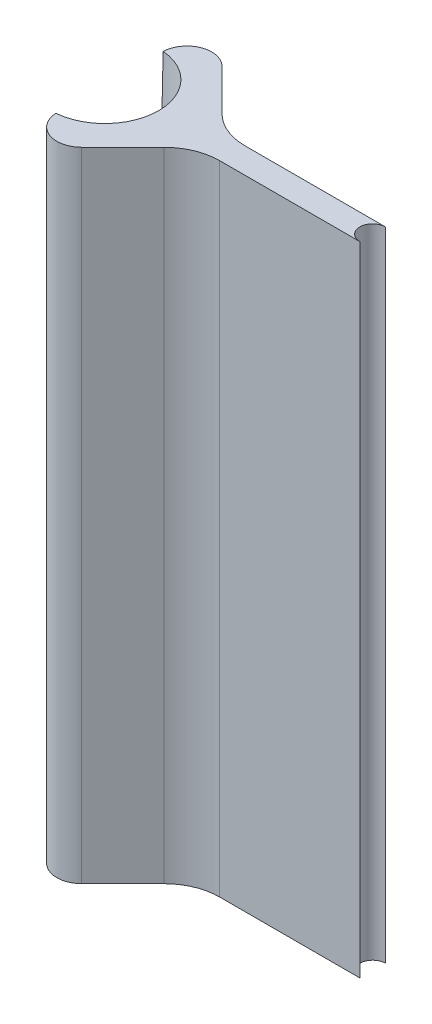
ISO-10303-21;
HEADER;
FILE_DESCRIPTION(('STEP AP214'),'2;1');
FILE_NAME('part.step','',(''),(''),'','','');
FILE_SCHEMA(('AUTOMOTIVE_DESIGN { 1 0 10303 214 1 1 1 1 }'));
ENDSEC;
DATA;
#1=APPLICATION_CONTEXT('core data for automotive mechanical design processes');
#2=APPLICATION_PROTOCOL_DEFINITION('international standard','automotive_design',2000,#1);
#3=PRODUCT_CONTEXT('',#1,'mechanical');
#4=PRODUCT('Part','Part','',(#3));
#5=PRODUCT_RELATED_PRODUCT_CATEGORY('part','',(#4));
#6=PRODUCT_DEFINITION_FORMATION('','',#4);
#7=PRODUCT_DEFINITION_CONTEXT('part definition',#1,'design');
#8=PRODUCT_DEFINITION('design','',#6,#7);
#9=PRODUCT_DEFINITION_SHAPE('','',#8);
#10=(LENGTH_UNIT() NAMED_UNIT(*) SI_UNIT(.MILLI.,.METRE.));
#11=(NAMED_UNIT(*) PLANE_ANGLE_UNIT() SI_UNIT($,.RADIAN.));
#12=(NAMED_UNIT(*) SI_UNIT($,.STERADIAN.) SOLID_ANGLE_UNIT());
#13=UNCERTAINTY_MEASURE_WITH_UNIT(LENGTH_MEASURE(1.E-05),#10,'distance_accuracy_value','');
#14=(GEOMETRIC_REPRESENTATION_CONTEXT(3) GLOBAL_UNCERTAINTY_ASSIGNED_CONTEXT((#13)) GLOBAL_UNIT_ASSIGNED_CONTEXT((#10,
#11,#12)) REPRESENTATION_CONTEXT('',''));
#15=CARTESIAN_POINT('',(0.,0.,0.));
#16=DIRECTION('',(0.,0.,1.));
#17=DIRECTION('',(1.,0.,0.));
#18=AXIS2_PLACEMENT_3D('',#15,#16,#17);
#19=CARTESIAN_POINT('',(4.2,10.,0.));
#20=DIRECTION('',(0.,-1.,0.));
#21=DIRECTION('',(0.,0.,-1.));
#22=AXIS2_PLACEMENT_3D('',#19,#20,#21);
#23=CYLINDRICAL_SURFACE('',#22,0.2);
#24=CARTESIAN_POINT('',(4.2,0.,0.));
#25=DIRECTION('',(0.,1.,0.));
#26=DIRECTION('',(0.,0.,1.));
#27=AXIS2_PLACEMENT_3D('',#24,#25,#26);
#28=CIRCLE('',#27,0.2);
#29=CARTESIAN_POINT('',(4.2,0.,-0.2));
#30=VERTEX_POINT('',#29);
#31=CARTESIAN_POINT('',(4.2,0.,0.2));
#32=VERTEX_POINT('',#31);
#33=EDGE_CURVE('E185',#30,#32,#28,.T.);
#34=ORIENTED_EDGE('',*,*,#33,.F.);
#35=DIRECTION('',(0.,-1.,0.));
#36=VECTOR('',#35,1.);
#37=CARTESIAN_POINT('',(4.2,10.,-0.2));
#38=LINE('',#37,#36);
#39=CARTESIAN_POINT('',(4.2,10.,-0.2));
#40=VERTEX_POINT('',#39);
#41=EDGE_CURVE('E11',#40,#30,#38,.T.);
#42=ORIENTED_EDGE('',*,*,#41,.F.);
#43=CARTESIAN_POINT('',(4.2,10.,0.));
#44=DIRECTION('',(0.,1.,0.));
#45=DIRECTION('',(0.,0.,1.));
#46=AXIS2_PLACEMENT_3D('',#43,#44,#45);
#47=CIRCLE('',#46,0.2);
#48=CARTESIAN_POINT('',(4.2,10.,0.2));
#49=VERTEX_POINT('',#48);
#50=EDGE_CURVE('E223',#40,#49,#47,.T.);
#51=ORIENTED_EDGE('',*,*,#50,.T.);
#52=DIRECTION('',(0.,-1.,0.));
#53=VECTOR('',#52,1.);
#54=CARTESIAN_POINT('',(4.2,10.,0.2));
#55=LINE('',#54,#53);
#56=EDGE_CURVE('E123',#49,#32,#55,.T.);
#57=ORIENTED_EDGE('',*,*,#56,.T.);
#58=EDGE_LOOP('',(#34,#42,#51,#57));
#59=FACE_BOUND('',#58,.T.);
#60=ADVANCED_FACE('F46',(#59),#23,.F.);
#61=CARTESIAN_POINT('',(0.,10.,-0.2));
#62=DIRECTION('',(0.,0.,-1.));
#63=DIRECTION('',(-1.,0.,0.));
#64=AXIS2_PLACEMENT_3D('',#61,#62,#63);
#65=PLANE('',#64);
#66=DIRECTION('',(1.,0.,0.));
#67=VECTOR('',#66,1.);
#68=CARTESIAN_POINT('',(0.,0.,-0.2));
#69=LINE('',#68,#67);
#70=CARTESIAN_POINT('',(2.,0.,-0.2));
#71=VERTEX_POINT('',#70);
#72=EDGE_CURVE('E189',#71,#30,#69,.T.);
#73=ORIENTED_EDGE('',*,*,#72,.F.);
#74=DIRECTION('',(0.,-1.,0.));
#75=VECTOR('',#74,1.);
#76=CARTESIAN_POINT('',(2.,10.,-0.2));
#77=LINE('',#76,#75);
#78=CARTESIAN_POINT('',(2.,10.,-0.2));
#79=VERTEX_POINT('',#78);
#80=EDGE_CURVE('E55',#79,#71,#77,.T.);
#81=ORIENTED_EDGE('',*,*,#80,.F.);
#82=DIRECTION('',(1.,0.,0.));
#83=VECTOR('',#82,1.);
#84=CARTESIAN_POINT('',(0.,10.,-0.2));
#85=LINE('',#84,#83);
#86=EDGE_CURVE('E267',#79,#40,#85,.T.);
#87=ORIENTED_EDGE('',*,*,#86,.T.);
#88=ORIENTED_EDGE('',*,*,#41,.T.);
#89=EDGE_LOOP('',(#73,#81,#87,#88));
#90=FACE_BOUND('',#89,.T.);
#91=ADVANCED_FACE('F254',(#90),#65,.T.);
#92=CARTESIAN_POINT('',(2.,10.,-1.07279220613579));
#93=DIRECTION('',(0.,-1.,0.));
#94=DIRECTION('',(0.,0.,-1.));
#95=AXIS2_PLACEMENT_3D('',#92,#93,#94);
#96=CYLINDRICAL_SURFACE('',#95,0.872792206135791);
#97=CARTESIAN_POINT('',(2.,0.,-1.07279220613579));
#98=DIRECTION('',(0.,1.,0.));
#99=DIRECTION('',(0.,0.,1.));
#100=AXIS2_PLACEMENT_3D('',#97,#98,#99);
#101=CIRCLE('',#100,0.872792206135791);
#102=CARTESIAN_POINT('',(1.38284271247461,0.,-0.455634918610408));
#103=VERTEX_POINT('',#102);
#104=EDGE_CURVE('E194',#103,#71,#101,.T.);
#105=ORIENTED_EDGE('',*,*,#104,.F.);
#106=DIRECTION('',(0.,-1.,0.));
#107=VECTOR('',#106,1.);
#108=CARTESIAN_POINT('',(1.38284271247461,10.,-0.455634918610408));
#109=LINE('',#108,#107);
#110=CARTESIAN_POINT('',(1.38284271247461,10.,-0.455634918610408));
#111=VERTEX_POINT('',#110);
#112=EDGE_CURVE('E240',#111,#103,#109,.T.);
#113=ORIENTED_EDGE('',*,*,#112,.F.);
#114=CARTESIAN_POINT('',(2.,10.,-1.07279220613579));
#115=DIRECTION('',(0.,1.,0.));
#116=DIRECTION('',(0.,0.,1.));
#117=AXIS2_PLACEMENT_3D('',#114,#115,#116);
#118=CIRCLE('',#117,0.872792206135791);
#119=EDGE_CURVE('E250',#111,#79,#118,.T.);
#120=ORIENTED_EDGE('',*,*,#119,.T.);
#121=ORIENTED_EDGE('',*,*,#80,.T.);
#122=EDGE_LOOP('',(#105,#113,#120,#121));
#123=FACE_BOUND('',#122,.T.);
#124=ADVANCED_FACE('F248',(#123),#96,.F.);
#125=CARTESIAN_POINT('',(0.919238815542513,10.,-0.919238815542511));
#126=DIRECTION('',(0.707106781186548,0.,-0.707106781186547));
#127=DIRECTION('',(-0.707106781186547,0.,-0.707106781186548));
#128=AXIS2_PLACEMENT_3D('',#125,#126,#127);
#129=PLANE('',#128);
#130=DIRECTION('',(0.707106781186547,0.,0.707106781186548));
#131=VECTOR('',#130,1.);
#132=CARTESIAN_POINT('',(0.919238815542513,0.,-0.919238815542511));
#133=LINE('',#132,#131);
#134=CARTESIAN_POINT('',(0.738477631085024,0.,-1.1));
#135=VERTEX_POINT('',#134);
#136=EDGE_CURVE('E198',#135,#103,#133,.T.);
#137=ORIENTED_EDGE('',*,*,#136,.F.);
#138=DIRECTION('',(0.,-1.,0.));
#139=VECTOR('',#138,1.);
#140=CARTESIAN_POINT('',(0.738477631085024,10.,-1.1));
#141=LINE('',#140,#139);
#142=CARTESIAN_POINT('',(0.738477631085024,10.,-1.1));
#143=VERTEX_POINT('',#142);
#144=EDGE_CURVE('E237',#143,#135,#141,.T.);
#145=ORIENTED_EDGE('',*,*,#144,.F.);
#146=DIRECTION('',(0.707106781186547,0.,0.707106781186548));
#147=VECTOR('',#146,1.);
#148=CARTESIAN_POINT('',(0.919238815542513,10.,-0.919238815542511));
#149=LINE('',#148,#147);
#150=EDGE_CURVE('E264',#143,#111,#149,.T.);
#151=ORIENTED_EDGE('',*,*,#150,.T.);
#152=ORIENTED_EDGE('',*,*,#112,.T.);
#153=EDGE_LOOP('',(#137,#145,#151,#152));
#154=FACE_BOUND('',#153,.T.);
#155=ADVANCED_FACE('F261',(#154),#129,.T.);
#156=CARTESIAN_POINT('',(0.463089493616225,10.,-0.824611862531202));
#157=DIRECTION('',(0.,-1.,0.));
#158=DIRECTION('',(0.,0.,-1.));
#159=AXIS2_PLACEMENT_3D('',#156,#157,#158);
#160=CYLINDRICAL_SURFACE('',#159,0.389457638925041);
#161=CARTESIAN_POINT('',(0.463089493616225,0.,-0.824611862531202));
#162=DIRECTION('',(0.,1.,0.));
#163=DIRECTION('',(0.,0.,1.));
#164=AXIS2_PLACEMENT_3D('',#161,#162,#163);
#165=CIRCLE('',#164,0.389457638925041);
#166=CARTESIAN_POINT('',(0.0751138585877696,0.,-0.858555332320462));
#167=VERTEX_POINT('',#166);
#168=EDGE_CURVE('E202',#167,#135,#165,.F.);
#169=ORIENTED_EDGE('',*,*,#168,.F.);
#170=DIRECTION('',(0.,-1.,0.));
#171=VECTOR('',#170,1.);
#172=CARTESIAN_POINT('',(0.0751138585877696,10.,-0.858555332320462));
#173=LINE('',#172,#171);
#174=CARTESIAN_POINT('',(0.0751138585877696,10.,-0.858555332320462));
#175=VERTEX_POINT('',#174);
#176=EDGE_CURVE('E234',#175,#167,#173,.T.);
#177=ORIENTED_EDGE('',*,*,#176,.F.);
#178=CARTESIAN_POINT('',(0.463089493616225,10.,-0.824611862531202));
#179=DIRECTION('',(0.,1.,0.));
#180=DIRECTION('',(0.,0.,1.));
#181=AXIS2_PLACEMENT_3D('',#178,#179,#180);
#182=CIRCLE('',#181,0.389457638925041);
#183=EDGE_CURVE('E272',#175,#143,#182,.F.);
#184=ORIENTED_EDGE('',*,*,#183,.T.);
#185=ORIENTED_EDGE('',*,*,#144,.T.);
#186=EDGE_LOOP('',(#169,#177,#184,#185));
#187=FACE_BOUND('',#186,.T.);
#188=ADVANCED_FACE('F323',(#187),#160,.T.);
#189=CARTESIAN_POINT('',(0.,10.,0.));
#190=DIRECTION('',(-0.996194698091746,0.,-0.0871557427476545));
#191=DIRECTION('',(-0.0871557427476545,0.,0.996194698091746));
#192=AXIS2_PLACEMENT_3D('',#189,#190,#191);
#193=PLANE('',#192);
#194=DIRECTION('',(-0.00182525215986723,-0.999780683474846,0.0208627276530114));
#195=VECTOR('',#194,1.);
#196=CARTESIAN_POINT('',(0.,-30.3145833930611,0.));
#197=LINE('',#196,#195);
#198=CARTESIAN_POINT('',(0.0553438966447606,0.,-0.632583633288259));
#199=VERTEX_POINT('',#198);
#200=CARTESIAN_POINT('',(0.0736004222011793,10.,-0.841256675264832));
#201=VERTEX_POINT('',#200);
#202=EDGE_CURVE('E305',#199,#201,#197,.F.);
#203=ORIENTED_EDGE('',*,*,#202,.T.);
#204=DIRECTION('',(0.0871557427476545,0.,-0.996194698091746));
#205=VECTOR('',#204,1.);
#206=CARTESIAN_POINT('',(0.,10.,0.));
#207=LINE('',#206,#205);
#208=EDGE_CURVE('E280',#201,#175,#207,.T.);
#209=ORIENTED_EDGE('',*,*,#208,.T.);
#210=ORIENTED_EDGE('',*,*,#176,.T.);
#211=DIRECTION('',(0.0871557427476545,0.,-0.996194698091746));
#212=VECTOR('',#211,1.);
#213=CARTESIAN_POINT('',(0.,0.,0.));
#214=LINE('',#213,#212);
#215=EDGE_CURVE('E206',#199,#167,#214,.T.);
#216=ORIENTED_EDGE('',*,*,#215,.F.);
#217=EDGE_LOOP('',(#203,#209,#210,#216));
#218=FACE_BOUND('',#217,.T.);
#219=ADVANCED_FACE('F320',(#218),#193,.T.);
#220=CARTESIAN_POINT('',(0.,10.,0.));
#221=DIRECTION('',(0.996194698091746,0.,-0.0871557427476545));
#222=DIRECTION('',(-0.0871557427476545,0.,-0.996194698091746));
#223=AXIS2_PLACEMENT_3D('',#220,#221,#222);
#224=PLANE('',#223);
#225=DIRECTION('',(0.0871557427476545,0.,0.996194698091746));
#226=VECTOR('',#225,1.);
#227=CARTESIAN_POINT('',(0.,10.,0.));
#228=LINE('',#227,#226);
#229=CARTESIAN_POINT('',(0.0736004222011793,10.,0.841256675264832));
#230=VERTEX_POINT('',#229);
#231=CARTESIAN_POINT('',(0.0751138585877696,10.,0.858555332320462));
#232=VERTEX_POINT('',#231);
#233=EDGE_CURVE('E282',#230,#232,#228,.T.);
#234=ORIENTED_EDGE('',*,*,#233,.F.);
#235=DIRECTION('',(-0.00182525215986723,-0.999780683474846,-0.0208627276530114));
#236=VECTOR('',#235,1.);
#237=CARTESIAN_POINT('',(0.,-30.3145833930611,0.));
#238=LINE('',#237,#236);
#239=CARTESIAN_POINT('',(0.0553438966447606,0.,0.632583633288259));
#240=VERTEX_POINT('',#239);
#241=EDGE_CURVE('E308',#240,#230,#238,.F.);
#242=ORIENTED_EDGE('',*,*,#241,.F.);
#243=DIRECTION('',(0.0871557427476545,0.,0.996194698091746));
#244=VECTOR('',#243,1.);
#245=CARTESIAN_POINT('',(0.,0.,0.));
#246=LINE('',#245,#244);
#247=CARTESIAN_POINT('',(0.0751138585877696,0.,0.858555332320462));
#248=VERTEX_POINT('',#247);
#249=EDGE_CURVE('E210',#240,#248,#246,.T.);
#250=ORIENTED_EDGE('',*,*,#249,.T.);
#251=DIRECTION('',(0.,-1.,0.));
#252=VECTOR('',#251,1.);
#253=CARTESIAN_POINT('',(0.0751138585877696,10.,0.858555332320462));
#254=LINE('',#253,#252);
#255=EDGE_CURVE('E230',#232,#248,#254,.T.);
#256=ORIENTED_EDGE('',*,*,#255,.F.);
#257=EDGE_LOOP('',(#234,#242,#250,#256));
#258=FACE_BOUND('',#257,.T.);
#259=ADVANCED_FACE('F291',(#258),#224,.F.);
#260=CARTESIAN_POINT('',(0.463089493616225,10.,0.824611862531202));
#261=DIRECTION('',(0.,-1.,0.));
#262=DIRECTION('',(0.,0.,-1.));
#263=AXIS2_PLACEMENT_3D('',#260,#261,#262);
#264=CYLINDRICAL_SURFACE('',#263,0.389457638925041);
#265=CARTESIAN_POINT('',(0.463089493616225,0.,0.824611862531202));
#266=DIRECTION('',(0.,1.,0.));
#267=DIRECTION('',(0.,0.,1.));
#268=AXIS2_PLACEMENT_3D('',#265,#266,#267);
#269=CIRCLE('',#268,0.389457638925041);
#270=CARTESIAN_POINT('',(0.738477631085025,0.,1.1));
#271=VERTEX_POINT('',#270);
#272=EDGE_CURVE('E213',#248,#271,#269,.T.);
#273=ORIENTED_EDGE('',*,*,#272,.T.);
#274=DIRECTION('',(0.,-1.,0.));
#275=VECTOR('',#274,1.);
#276=CARTESIAN_POINT('',(0.738477631085025,10.,1.1));
#277=LINE('',#276,#275);
#278=CARTESIAN_POINT('',(0.738477631085025,10.,1.1));
#279=VERTEX_POINT('',#278);
#280=EDGE_CURVE('E174',#279,#271,#277,.T.);
#281=ORIENTED_EDGE('',*,*,#280,.F.);
#282=CARTESIAN_POINT('',(0.463089493616225,10.,0.824611862531202));
#283=DIRECTION('',(0.,1.,0.));
#284=DIRECTION('',(0.,0.,1.));
#285=AXIS2_PLACEMENT_3D('',#282,#283,#284);
#286=CIRCLE('',#285,0.389457638925041);
#287=EDGE_CURVE('E163',#232,#279,#286,.T.);
#288=ORIENTED_EDGE('',*,*,#287,.F.);
#289=ORIENTED_EDGE('',*,*,#255,.T.);
#290=EDGE_LOOP('',(#273,#281,#288,#289));
#291=FACE_BOUND('',#290,.T.);
#292=ADVANCED_FACE('F294',(#291),#264,.T.);
#293=CARTESIAN_POINT('',(0.919238815542514,10.,0.91923881554251));
#294=DIRECTION('',(-0.707106781186549,0.,-0.707106781186546));
#295=DIRECTION('',(-0.707106781186546,0.,0.707106781186549));
#296=AXIS2_PLACEMENT_3D('',#293,#294,#295);
#297=PLANE('',#296);
#298=DIRECTION('',(0.707106781186546,0.,-0.707106781186549));
#299=VECTOR('',#298,1.);
#300=CARTESIAN_POINT('',(0.919238815542514,0.,0.91923881554251));
#301=LINE('',#300,#299);
#302=CARTESIAN_POINT('',(1.38284271247461,0.,0.455634918610408));
#303=VERTEX_POINT('',#302);
#304=EDGE_CURVE('E172',#271,#303,#301,.T.);
#305=ORIENTED_EDGE('',*,*,#304,.T.);
#306=DIRECTION('',(0.,-1.,0.));
#307=VECTOR('',#306,1.);
#308=CARTESIAN_POINT('',(1.38284271247461,10.,0.455634918610408));
#309=LINE('',#308,#307);
#310=CARTESIAN_POINT('',(1.38284271247461,10.,0.455634918610408));
#311=VERTEX_POINT('',#310);
#312=EDGE_CURVE('E169',#311,#303,#309,.T.);
#313=ORIENTED_EDGE('',*,*,#312,.F.);
#314=DIRECTION('',(0.707106781186546,0.,-0.707106781186549));
#315=VECTOR('',#314,1.);
#316=CARTESIAN_POINT('',(0.919238815542514,10.,0.91923881554251));
#317=LINE('',#316,#315);
#318=EDGE_CURVE('E156',#279,#311,#317,.T.);
#319=ORIENTED_EDGE('',*,*,#318,.F.);
#320=ORIENTED_EDGE('',*,*,#280,.T.);
#321=EDGE_LOOP('',(#305,#313,#319,#320));
#322=FACE_BOUND('',#321,.T.);
#323=ADVANCED_FACE('F170',(#322),#297,.F.);
#324=CARTESIAN_POINT('',(2.,10.,1.07279220613579));
#325=DIRECTION('',(0.,-1.,0.));
#326=DIRECTION('',(0.,0.,-1.));
#327=AXIS2_PLACEMENT_3D('',#324,#325,#326);
#328=CYLINDRICAL_SURFACE('',#327,0.872792206135791);
#329=CARTESIAN_POINT('',(2.,0.,1.07279220613579));
#330=DIRECTION('',(0.,1.,0.));
#331=DIRECTION('',(0.,0.,1.));
#332=AXIS2_PLACEMENT_3D('',#329,#330,#331);
#333=CIRCLE('',#332,0.872792206135791);
#334=CARTESIAN_POINT('',(2.,0.,0.2));
#335=VERTEX_POINT('',#334);
#336=EDGE_CURVE('E115',#303,#335,#333,.F.);
#337=ORIENTED_EDGE('',*,*,#336,.T.);
#338=DIRECTION('',(0.,-1.,0.));
#339=VECTOR('',#338,1.);
#340=CARTESIAN_POINT('',(2.,10.,0.2));
#341=LINE('',#340,#339);
#342=CARTESIAN_POINT('',(2.,10.,0.2));
#343=VERTEX_POINT('',#342);
#344=EDGE_CURVE('E175',#343,#335,#341,.T.);
#345=ORIENTED_EDGE('',*,*,#344,.F.);
#346=CARTESIAN_POINT('',(2.,10.,1.07279220613579));
#347=DIRECTION('',(0.,1.,0.));
#348=DIRECTION('',(0.,0.,1.));
#349=AXIS2_PLACEMENT_3D('',#346,#347,#348);
#350=CIRCLE('',#349,0.872792206135791);
#351=EDGE_CURVE('E161',#311,#343,#350,.F.);
#352=ORIENTED_EDGE('',*,*,#351,.F.);
#353=ORIENTED_EDGE('',*,*,#312,.T.);
#354=EDGE_LOOP('',(#337,#345,#352,#353));
#355=FACE_BOUND('',#354,.T.);
#356=ADVANCED_FACE('F177',(#355),#328,.F.);
#357=CARTESIAN_POINT('',(0.,10.,0.2));
#358=DIRECTION('',(0.,0.,-1.));
#359=DIRECTION('',(-1.,0.,0.));
#360=AXIS2_PLACEMENT_3D('',#357,#358,#359);
#361=PLANE('',#360);
#362=DIRECTION('',(1.,0.,0.));
#363=VECTOR('',#362,1.);
#364=CARTESIAN_POINT('',(0.,0.,0.2));
#365=LINE('',#364,#363);
#366=EDGE_CURVE('E220',#335,#32,#365,.T.);
#367=ORIENTED_EDGE('',*,*,#366,.T.);
#368=ORIENTED_EDGE('',*,*,#56,.F.);
#369=DIRECTION('',(1.,0.,0.));
#370=VECTOR('',#369,1.);
#371=CARTESIAN_POINT('',(0.,10.,0.2));
#372=LINE('',#371,#370);
#373=EDGE_CURVE('E66',#343,#49,#372,.T.);
#374=ORIENTED_EDGE('',*,*,#373,.F.);
#375=ORIENTED_EDGE('',*,*,#344,.T.);
#376=EDGE_LOOP('',(#367,#368,#374,#375));
#377=FACE_BOUND('',#376,.T.);
#378=ADVANCED_FACE('F297',(#377),#361,.F.);
#379=CARTESIAN_POINT('',(0.,10.,0.));
#380=DIRECTION('',(0.,1.,0.));
#381=DIRECTION('',(0.,0.,1.));
#382=AXIS2_PLACEMENT_3D('',#379,#380,#381);
#383=PLANE('',#382);
#384=CARTESIAN_POINT('',(0.,10.,0.));
#385=DIRECTION('',(0.,1.,0.));
#386=DIRECTION('',(0.,0.,1.));
#387=AXIS2_PLACEMENT_3D('',#384,#385,#386);
#388=CIRCLE('',#387,0.8444701390966);
#389=EDGE_CURVE('E190',#201,#230,#388,.F.);
#390=ORIENTED_EDGE('',*,*,#389,.T.);
#391=ORIENTED_EDGE('',*,*,#233,.T.);
#392=ORIENTED_EDGE('',*,*,#287,.T.);
#393=ORIENTED_EDGE('',*,*,#318,.T.);
#394=ORIENTED_EDGE('',*,*,#351,.T.);
#395=ORIENTED_EDGE('',*,*,#373,.T.);
#396=ORIENTED_EDGE('',*,*,#50,.F.);
#397=ORIENTED_EDGE('',*,*,#86,.F.);
#398=ORIENTED_EDGE('',*,*,#119,.F.);
#399=ORIENTED_EDGE('',*,*,#150,.F.);
#400=ORIENTED_EDGE('',*,*,#183,.F.);
#401=ORIENTED_EDGE('',*,*,#208,.F.);
#402=EDGE_LOOP('',(#390,#391,#392,#393,#394,#395,#396,#397,#398,#399,#400,#401));
#403=FACE_BOUND('',#402,.T.);
#404=ADVANCED_FACE('F159',(#403),#383,.T.);
#405=CARTESIAN_POINT('',(0.,0.,0.));
#406=DIRECTION('',(0.,1.,0.));
#407=DIRECTION('',(0.,0.,1.));
#408=AXIS2_PLACEMENT_3D('',#405,#406,#407);
#409=PLANE('',#408);
#410=ORIENTED_EDGE('',*,*,#249,.F.);
#411=CARTESIAN_POINT('',(0.,0.,0.));
#412=DIRECTION('',(0.,-1.,0.));
#413=DIRECTION('',(0.,0.,-1.));
#414=AXIS2_PLACEMENT_3D('',#411,#412,#413);
#415=CIRCLE('',#414,0.635);
#416=EDGE_CURVE('E301',#199,#240,#415,.T.);
#417=ORIENTED_EDGE('',*,*,#416,.F.);
#418=ORIENTED_EDGE('',*,*,#215,.T.);
#419=ORIENTED_EDGE('',*,*,#168,.T.);
#420=ORIENTED_EDGE('',*,*,#136,.T.);
#421=ORIENTED_EDGE('',*,*,#104,.T.);
#422=ORIENTED_EDGE('',*,*,#72,.T.);
#423=ORIENTED_EDGE('',*,*,#33,.T.);
#424=ORIENTED_EDGE('',*,*,#366,.F.);
#425=ORIENTED_EDGE('',*,*,#336,.F.);
#426=ORIENTED_EDGE('',*,*,#304,.F.);
#427=ORIENTED_EDGE('',*,*,#272,.F.);
#428=EDGE_LOOP('',(#410,#417,#418,#419,#420,#421,#422,#423,#424,#425,#426,#427));
#429=FACE_BOUND('',#428,.T.);
#430=ADVANCED_FACE('F257',(#429),#409,.F.);
#431=CARTESIAN_POINT('',(0.,0.,0.));
#432=DIRECTION('',(0.,1.,0.));
#433=DIRECTION('',(0.,0.,-1.));
#434=AXIS2_PLACEMENT_3D('',#431,#432,#433);
#435=CONICAL_SURFACE('',#434,0.635,0.020943951023932);
#436=ORIENTED_EDGE('',*,*,#416,.T.);
#437=ORIENTED_EDGE('',*,*,#241,.T.);
#438=ORIENTED_EDGE('',*,*,#389,.F.);
#439=ORIENTED_EDGE('',*,*,#202,.F.);
#440=EDGE_LOOP('',(#436,#437,#438,#439));
#441=FACE_BOUND('',#440,.T.);
#442=ADVANCED_FACE('F312',(#441),#435,.F.);
#443=CLOSED_SHELL('',(#60,#91,#124,#155,#188,#219,#259,#292,#323,#356,#378,#404,#430,#442));
#444=MANIFOLD_SOLID_BREP('B2',#443);
#445=ADVANCED_BREP_SHAPE_REPRESENTATION('',(#18,#444),#14);
#446=SHAPE_DEFINITION_REPRESENTATION(#9,#445);
ENDSEC;
END-ISO-10303-21;
